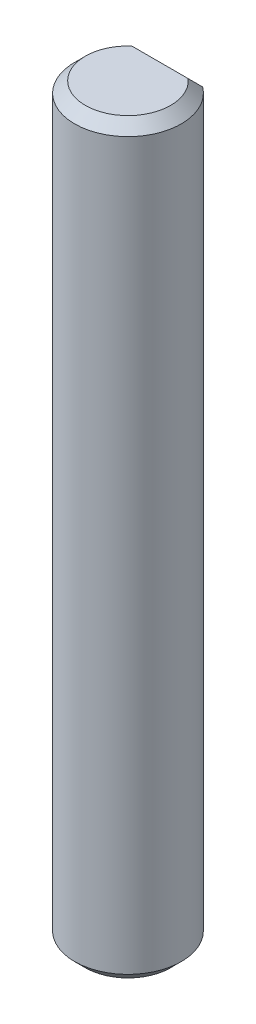
ISO-10303-21;
HEADER;
FILE_DESCRIPTION(('STEP AP214'),'2;1');
FILE_NAME('part.step','',(''),(''),'','','');
FILE_SCHEMA(('AUTOMOTIVE_DESIGN { 1 0 10303 214 1 1 1 1 }'));
ENDSEC;
DATA;
#1=APPLICATION_CONTEXT('core data for automotive mechanical design processes');
#2=APPLICATION_PROTOCOL_DEFINITION('international standard','automotive_design',2000,#1);
#3=PRODUCT_CONTEXT('',#1,'mechanical');
#4=PRODUCT('Part','Part','',(#3));
#5=PRODUCT_RELATED_PRODUCT_CATEGORY('part','',(#4));
#6=PRODUCT_DEFINITION_FORMATION('','',#4);
#7=PRODUCT_DEFINITION_CONTEXT('part definition',#1,'design');
#8=PRODUCT_DEFINITION('design','',#6,#7);
#9=PRODUCT_DEFINITION_SHAPE('','',#8);
#10=(LENGTH_UNIT() NAMED_UNIT(*) SI_UNIT(.MILLI.,.METRE.));
#11=(NAMED_UNIT(*) PLANE_ANGLE_UNIT() SI_UNIT($,.RADIAN.));
#12=(NAMED_UNIT(*) SI_UNIT($,.STERADIAN.) SOLID_ANGLE_UNIT());
#13=UNCERTAINTY_MEASURE_WITH_UNIT(LENGTH_MEASURE(1.E-05),#10,'distance_accuracy_value','');
#14=(GEOMETRIC_REPRESENTATION_CONTEXT(3) GLOBAL_UNCERTAINTY_ASSIGNED_CONTEXT((#13)) GLOBAL_UNIT_ASSIGNED_CONTEXT((#10,
#11,#12)) REPRESENTATION_CONTEXT('',''));
#15=CARTESIAN_POINT('',(0.,0.,0.));
#16=DIRECTION('',(0.,0.,1.));
#17=DIRECTION('',(1.,0.,0.));
#18=AXIS2_PLACEMENT_3D('',#15,#16,#17);
#19=CARTESIAN_POINT('',(0.,17.5,0.));
#20=DIRECTION('',(0.,-1.,0.));
#21=DIRECTION('',(0.,0.,-1.));
#22=AXIS2_PLACEMENT_3D('',#19,#20,#21);
#23=CYLINDRICAL_SURFACE('',#22,2.5);
#24=DIRECTION('',(0.,-1.,0.));
#25=VECTOR('',#24,1.);
#26=CARTESIAN_POINT('',(-1.5,17.5,-2.));
#27=LINE('',#26,#25);
#28=CARTESIAN_POINT('',(-1.5,-8.,-2.));
#29=VERTEX_POINT('',#28);
#30=CARTESIAN_POINT('',(-1.5,-17.,-2.));
#31=VERTEX_POINT('',#30);
#32=EDGE_CURVE('E111',#29,#31,#27,.T.);
#33=ORIENTED_EDGE('',*,*,#32,.T.);
#34=CARTESIAN_POINT('',(0.,-17.,0.));
#35=DIRECTION('',(0.,1.,0.));
#36=DIRECTION('',(0.,0.,1.));
#37=AXIS2_PLACEMENT_3D('',#34,#35,#36);
#38=CIRCLE('',#37,2.5);
#39=CARTESIAN_POINT('',(1.5,-17.,-2.));
#40=VERTEX_POINT('',#39);
#41=EDGE_CURVE('E108',#31,#40,#38,.T.);
#42=ORIENTED_EDGE('',*,*,#41,.T.);
#43=DIRECTION('',(0.,-1.,0.));
#44=VECTOR('',#43,1.);
#45=CARTESIAN_POINT('',(1.5,17.5,-2.));
#46=LINE('',#45,#44);
#47=CARTESIAN_POINT('',(1.5,-8.,-2.));
#48=VERTEX_POINT('',#47);
#49=EDGE_CURVE('E102',#40,#48,#46,.F.);
#50=ORIENTED_EDGE('',*,*,#49,.T.);
#51=CARTESIAN_POINT('',(0.,-8.,0.));
#52=DIRECTION('',(0.,1.,0.));
#53=DIRECTION('',(0.,0.,1.));
#54=AXIS2_PLACEMENT_3D('',#51,#52,#53);
#55=CIRCLE('',#54,2.5);
#56=EDGE_CURVE('E106',#48,#29,#55,.T.);
#57=ORIENTED_EDGE('',*,*,#56,.T.);
#58=EDGE_LOOP('',(#33,#42,#50,#57));
#59=FACE_BOUND('',#58,.T.);
#60=DIRECTION('',(0.,-1.,0.));
#61=VECTOR('',#60,1.);
#62=CARTESIAN_POINT('',(1.5,17.5,-2.));
#63=LINE('',#62,#61);
#64=CARTESIAN_POINT('',(1.5,17.,-2.));
#65=VERTEX_POINT('',#64);
#66=CARTESIAN_POINT('',(1.5,8.,-2.));
#67=VERTEX_POINT('',#66);
#68=EDGE_CURVE('E119',#65,#67,#63,.T.);
#69=ORIENTED_EDGE('',*,*,#68,.F.);
#70=CARTESIAN_POINT('',(0.,17.,0.));
#71=DIRECTION('',(0.,1.,0.));
#72=DIRECTION('',(0.,0.,1.));
#73=AXIS2_PLACEMENT_3D('',#70,#71,#72);
#74=CIRCLE('',#73,2.5);
#75=CARTESIAN_POINT('',(-1.5,17.,-2.));
#76=VERTEX_POINT('',#75);
#77=EDGE_CURVE('E145',#65,#76,#74,.F.);
#78=ORIENTED_EDGE('',*,*,#77,.T.);
#79=DIRECTION('',(0.,-1.,0.));
#80=VECTOR('',#79,1.);
#81=CARTESIAN_POINT('',(-1.5,17.5,-2.));
#82=LINE('',#81,#80);
#83=CARTESIAN_POINT('',(-1.5,8.,-2.));
#84=VERTEX_POINT('',#83);
#85=EDGE_CURVE('E130',#84,#76,#82,.F.);
#86=ORIENTED_EDGE('',*,*,#85,.F.);
#87=CARTESIAN_POINT('',(0.,8.,0.));
#88=DIRECTION('',(0.,-1.,0.));
#89=DIRECTION('',(0.,0.,-1.));
#90=AXIS2_PLACEMENT_3D('',#87,#88,#89);
#91=CIRCLE('',#90,2.5);
#92=EDGE_CURVE('E118',#84,#67,#91,.T.);
#93=ORIENTED_EDGE('',*,*,#92,.T.);
#94=EDGE_LOOP('',(#69,#78,#86,#93));
#95=FACE_BOUND('',#94,.T.);
#96=ADVANCED_FACE('F39',(#59,#95),#23,.T.);
#97=CARTESIAN_POINT('',(0.,17.5,0.));
#98=DIRECTION('',(0.,1.,0.));
#99=DIRECTION('',(0.,0.,1.));
#100=AXIS2_PLACEMENT_3D('',#97,#98,#99);
#101=PLANE('',#100);
#102=CARTESIAN_POINT('',(0.,17.5,0.));
#103=DIRECTION('',(0.,1.,0.));
#104=DIRECTION('',(0.,0.,1.));
#105=AXIS2_PLACEMENT_3D('',#102,#103,#104);
#106=CIRCLE('',#105,2.00000000000001);
#107=CARTESIAN_POINT('',(-1.3228756555323,17.5,-1.50000000000001));
#108=VERTEX_POINT('',#107);
#109=CARTESIAN_POINT('',(1.3228756555323,17.5,-1.50000000000001));
#110=VERTEX_POINT('',#109);
#111=EDGE_CURVE('E136',#108,#110,#106,.T.);
#112=ORIENTED_EDGE('',*,*,#111,.T.);
#113=DIRECTION('',(-1.,0.,0.));
#114=VECTOR('',#113,1.);
#115=CARTESIAN_POINT('',(0.,17.5,-1.50000000000001));
#116=LINE('',#115,#114);
#117=EDGE_CURVE('E138',#110,#108,#116,.T.);
#118=ORIENTED_EDGE('',*,*,#117,.T.);
#119=EDGE_LOOP('',(#112,#118));
#120=FACE_BOUND('',#119,.T.);
#121=ADVANCED_FACE('F185',(#120),#101,.T.);
#122=CARTESIAN_POINT('',(0.,-17.5,0.));
#123=DIRECTION('',(0.,1.,0.));
#124=DIRECTION('',(0.,0.,1.));
#125=AXIS2_PLACEMENT_3D('',#122,#123,#124);
#126=PLANE('',#125);
#127=CARTESIAN_POINT('',(0.,-17.5,0.));
#128=DIRECTION('',(0.,1.,0.));
#129=DIRECTION('',(0.,0.,1.));
#130=AXIS2_PLACEMENT_3D('',#127,#128,#129);
#131=CIRCLE('',#130,1.99999999999998);
#132=CARTESIAN_POINT('',(1.32287565553229,-17.5,-1.49999999999998));
#133=VERTEX_POINT('',#132);
#134=CARTESIAN_POINT('',(-1.32287565553229,-17.5,-1.49999999999998));
#135=VERTEX_POINT('',#134);
#136=EDGE_CURVE('E61',#133,#135,#131,.F.);
#137=ORIENTED_EDGE('',*,*,#136,.T.);
#138=DIRECTION('',(1.,0.,0.));
#139=VECTOR('',#138,1.);
#140=CARTESIAN_POINT('',(0.,-17.5,-1.49999999999998));
#141=LINE('',#140,#139);
#142=EDGE_CURVE('E54',#135,#133,#141,.T.);
#143=ORIENTED_EDGE('',*,*,#142,.T.);
#144=EDGE_LOOP('',(#137,#143));
#145=FACE_BOUND('',#144,.T.);
#146=ADVANCED_FACE('F183',(#145),#126,.F.);
#147=CARTESIAN_POINT('',(-2.89416499694655,-8.,-37.));
#148=DIRECTION('',(0.,1.,0.));
#149=DIRECTION('',(0.,0.,1.));
#150=AXIS2_PLACEMENT_3D('',#147,#148,#149);
#151=PLANE('',#150);
#152=DIRECTION('',(-1.,0.,0.));
#153=VECTOR('',#152,1.);
#154=CARTESIAN_POINT('',(-2.89416499694655,-8.,-2.));
#155=LINE('',#154,#153);
#156=EDGE_CURVE('E117',#48,#29,#155,.T.);
#157=ORIENTED_EDGE('',*,*,#156,.T.);
#158=ORIENTED_EDGE('',*,*,#56,.F.);
#159=EDGE_LOOP('',(#157,#158));
#160=FACE_BOUND('',#159,.T.);
#161=ADVANCED_FACE('F116',(#160),#151,.F.);
#162=CARTESIAN_POINT('',(0.,0.,-2.));
#163=DIRECTION('',(0.,0.,1.));
#164=DIRECTION('',(1.,0.,0.));
#165=AXIS2_PLACEMENT_3D('',#162,#163,#164);
#166=PLANE('',#165);
#167=ORIENTED_EDGE('',*,*,#49,.F.);
#168=DIRECTION('',(-1.,0.,0.));
#169=VECTOR('',#168,1.);
#170=CARTESIAN_POINT('',(0.,-17.,-2.));
#171=LINE('',#170,#169);
#172=EDGE_CURVE('E11',#40,#31,#171,.T.);
#173=ORIENTED_EDGE('',*,*,#172,.T.);
#174=ORIENTED_EDGE('',*,*,#32,.F.);
#175=ORIENTED_EDGE('',*,*,#156,.F.);
#176=EDGE_LOOP('',(#167,#173,#174,#175));
#177=FACE_BOUND('',#176,.T.);
#178=ADVANCED_FACE('F121',(#177),#166,.F.);
#179=CARTESIAN_POINT('',(-2.89416499694655,8.,-37.));
#180=DIRECTION('',(0.,-1.,0.));
#181=DIRECTION('',(0.,0.,-1.));
#182=AXIS2_PLACEMENT_3D('',#179,#180,#181);
#183=PLANE('',#182);
#184=DIRECTION('',(1.,0.,0.));
#185=VECTOR('',#184,1.);
#186=CARTESIAN_POINT('',(-2.89416499694655,8.,-2.));
#187=LINE('',#186,#185);
#188=EDGE_CURVE('E112',#84,#67,#187,.T.);
#189=ORIENTED_EDGE('',*,*,#188,.T.);
#190=ORIENTED_EDGE('',*,*,#92,.F.);
#191=EDGE_LOOP('',(#189,#190));
#192=FACE_BOUND('',#191,.T.);
#193=ADVANCED_FACE('F221',(#192),#183,.F.);
#194=CARTESIAN_POINT('',(0.,0.,-2.));
#195=DIRECTION('',(0.,0.,-1.));
#196=DIRECTION('',(-1.,0.,0.));
#197=AXIS2_PLACEMENT_3D('',#194,#195,#196);
#198=PLANE('',#197);
#199=ORIENTED_EDGE('',*,*,#85,.T.);
#200=DIRECTION('',(1.,0.,0.));
#201=VECTOR('',#200,1.);
#202=CARTESIAN_POINT('',(0.,17.,-2.));
#203=LINE('',#202,#201);
#204=EDGE_CURVE('E141',#76,#65,#203,.T.);
#205=ORIENTED_EDGE('',*,*,#204,.T.);
#206=ORIENTED_EDGE('',*,*,#68,.T.);
#207=ORIENTED_EDGE('',*,*,#188,.F.);
#208=EDGE_LOOP('',(#199,#205,#206,#207));
#209=FACE_BOUND('',#208,.T.);
#210=ADVANCED_FACE('F230',(#209),#198,.T.);
#211=CARTESIAN_POINT('',(0.,17.5,0.));
#212=DIRECTION('',(0.,-1.,0.));
#213=DIRECTION('',(0.,0.,-1.));
#214=AXIS2_PLACEMENT_3D('',#211,#212,#213);
#215=CONICAL_SURFACE('',#214,2.00000000000001,0.785398163397446);
#216=CARTESIAN_POINT('',(-1.3228756555323,17.5,-1.50000000000001));
#217=CARTESIAN_POINT('',(-1.33856024136969,17.4584991639331,-1.54150083606694));
#218=CARTESIAN_POINT('',(-1.35398671696421,17.4169498376851,-1.58305016231496));
#219=CARTESIAN_POINT('',(-1.38436438703584,17.3337667834554,-1.66623321654464));
#220=CARTESIAN_POINT('',(-1.39931560745199,17.2921330602124,-1.7078669397876));
#221=CARTESIAN_POINT('',(-1.42878519796258,17.2087898570011,-1.79121014299889));
#222=CARTESIAN_POINT('',(-1.44330357435469,17.1670803781444,-1.83291962185564));
#223=CARTESIAN_POINT('',(-1.47194219050032,17.0835906920568,-1.91640930794319));
#224=CARTESIAN_POINT('',(-1.48606240845706,17.0418104810861,-1.95818951891394));
#225=CARTESIAN_POINT('',(-1.5,17.,-2.));
#226=B_SPLINE_CURVE_WITH_KNOTS('',3,(#216,#217,#218,#219,#220,#221,#222,#223,#224,#225),
.UNSPECIFIED.,.F.,.F.,(4,2,2,2,4),(0.,0.182250890874288,0.364491817508485,0.546730091336216,
0.728978322325567),.UNSPECIFIED.);
#227=EDGE_CURVE('E126',#76,#108,#226,.F.);
#228=ORIENTED_EDGE('',*,*,#227,.F.);
#229=ORIENTED_EDGE('',*,*,#77,.F.);
#230=CARTESIAN_POINT('',(1.5,17.,-2.));
#231=CARTESIAN_POINT('',(1.48606240845706,17.0418104810861,-1.95818951891394));
#232=CARTESIAN_POINT('',(1.47194219050032,17.0835906920568,-1.91640930794319));
#233=CARTESIAN_POINT('',(1.44330357435469,17.1670803781444,-1.83291962185564));
#234=CARTESIAN_POINT('',(1.42878519796258,17.2087898570011,-1.79121014299889));
#235=CARTESIAN_POINT('',(1.39931560745199,17.2921330602124,-1.7078669397876));
#236=CARTESIAN_POINT('',(1.38436438703585,17.3337667834554,-1.66623321654464));
#237=CARTESIAN_POINT('',(1.35398671696421,17.4169498376851,-1.58305016231496));
#238=CARTESIAN_POINT('',(1.33856024136969,17.4584991639331,-1.54150083606694));
#239=CARTESIAN_POINT('',(1.3228756555323,17.5,-1.50000000000001));
#240=B_SPLINE_CURVE_WITH_KNOTS('',3,(#230,#231,#232,#233,#234,#235,#236,#237,#238,#239),
.UNSPECIFIED.,.F.,.F.,(4,2,2,2,4),(0.,0.182248230989351,0.364486504817082,0.546727431451279,
0.728978322325568),.UNSPECIFIED.);
#241=EDGE_CURVE('E122',#110,#65,#240,.F.);
#242=ORIENTED_EDGE('',*,*,#241,.F.);
#243=ORIENTED_EDGE('',*,*,#111,.F.);
#244=EDGE_LOOP('',(#228,#229,#242,#243));
#245=FACE_BOUND('',#244,.T.);
#246=ADVANCED_FACE('F160',(#245),#215,.T.);
#247=CARTESIAN_POINT('',(0.,17.5,-1.50000000000001));
#248=DIRECTION('',(0.,-0.707106781186546,0.707106781186549));
#249=DIRECTION('',(-1.,0.,0.));
#250=AXIS2_PLACEMENT_3D('',#247,#248,#249);
#251=PLANE('',#250);
#252=ORIENTED_EDGE('',*,*,#241,.T.);
#253=ORIENTED_EDGE('',*,*,#204,.F.);
#254=ORIENTED_EDGE('',*,*,#227,.T.);
#255=ORIENTED_EDGE('',*,*,#117,.F.);
#256=EDGE_LOOP('',(#252,#253,#254,#255));
#257=FACE_BOUND('',#256,.T.);
#258=ADVANCED_FACE('F164',(#257),#251,.F.);
#259=CARTESIAN_POINT('',(0.,-17.,0.));
#260=DIRECTION('',(0.,1.,0.));
#261=DIRECTION('',(0.,0.,1.));
#262=AXIS2_PLACEMENT_3D('',#259,#260,#261);
#263=CONICAL_SURFACE('',#262,2.5,0.78539816339745);
#264=CARTESIAN_POINT('',(1.32287565553229,-17.5,-1.49999999999998));
#265=CARTESIAN_POINT('',(1.33856024136969,-17.4584991639331,-1.54150083606692));
#266=CARTESIAN_POINT('',(1.35398671696421,-17.416949837685,-1.58305016231494));
#267=CARTESIAN_POINT('',(1.38436438703584,-17.3337667834554,-1.66623321654462));
#268=CARTESIAN_POINT('',(1.39931560745198,-17.2921330602124,-1.70786693978759));
#269=CARTESIAN_POINT('',(1.42878519796258,-17.2087898570011,-1.79121014299888));
#270=CARTESIAN_POINT('',(1.44330357435469,-17.1670803781444,-1.83291962185563));
#271=CARTESIAN_POINT('',(1.47194219050032,-17.0835906920568,-1.91640930794319));
#272=CARTESIAN_POINT('',(1.48606240845706,-17.041810481086,-1.95818951891394));
#273=CARTESIAN_POINT('',(1.5,-17.,-2.));
#274=B_SPLINE_CURVE_WITH_KNOTS('',3,(#264,#265,#266,#267,#268,#269,#270,#271,#272,#273),
.UNSPECIFIED.,.F.,.F.,(4,2,2,2,4),(0.,0.182250890874297,0.364491817508502,0.546730091336241,
0.7289783223256),.UNSPECIFIED.);
#275=EDGE_CURVE('E69',#40,#133,#274,.F.);
#276=ORIENTED_EDGE('',*,*,#275,.F.);
#277=ORIENTED_EDGE('',*,*,#41,.F.);
#278=CARTESIAN_POINT('',(-1.5,-17.,-2.));
#279=CARTESIAN_POINT('',(-1.48606240845706,-17.041810481086,-1.95818951891394));
#280=CARTESIAN_POINT('',(-1.47194219050032,-17.0835906920568,-1.91640930794319));
#281=CARTESIAN_POINT('',(-1.44330357435469,-17.1670803781444,-1.83291962185563));
#282=CARTESIAN_POINT('',(-1.42878519796258,-17.2087898570011,-1.79121014299888));
#283=CARTESIAN_POINT('',(-1.39931560745198,-17.2921330602124,-1.70786693978759));
#284=CARTESIAN_POINT('',(-1.38436438703584,-17.3337667834554,-1.66623321654462));
#285=CARTESIAN_POINT('',(-1.35398671696421,-17.416949837685,-1.58305016231494));
#286=CARTESIAN_POINT('',(-1.33856024136969,-17.4584991639331,-1.54150083606692));
#287=CARTESIAN_POINT('',(-1.32287565553229,-17.5,-1.49999999999998));
#288=B_SPLINE_CURVE_WITH_KNOTS('',3,(#278,#279,#280,#281,#282,#283,#284,#285,#286,#287),
.UNSPECIFIED.,.F.,.F.,(4,2,2,2,4),(0.,0.182248230989359,0.364486504817098,0.546727431451303,
0.728978322325601),.UNSPECIFIED.);
#289=EDGE_CURVE('E45',#135,#31,#288,.F.);
#290=ORIENTED_EDGE('',*,*,#289,.F.);
#291=ORIENTED_EDGE('',*,*,#136,.F.);
#292=EDGE_LOOP('',(#276,#277,#290,#291));
#293=FACE_BOUND('',#292,.T.);
#294=ADVANCED_FACE('F169',(#293),#263,.T.);
#295=CARTESIAN_POINT('',(0.,-17.5,-1.49999999999998));
#296=DIRECTION('',(0.,0.707106781186548,0.707106781186547));
#297=DIRECTION('',(1.,0.,0.));
#298=AXIS2_PLACEMENT_3D('',#295,#296,#297);
#299=PLANE('',#298);
#300=ORIENTED_EDGE('',*,*,#289,.T.);
#301=ORIENTED_EDGE('',*,*,#172,.F.);
#302=ORIENTED_EDGE('',*,*,#275,.T.);
#303=ORIENTED_EDGE('',*,*,#142,.F.);
#304=EDGE_LOOP('',(#300,#301,#302,#303));
#305=FACE_BOUND('',#304,.T.);
#306=ADVANCED_FACE('F42',(#305),#299,.F.);
#307=CLOSED_SHELL('',(#96,#121,#146,#161,#178,#193,#210,#246,#258,#294,#306));
#308=MANIFOLD_SOLID_BREP('B2',#307);
#309=ADVANCED_BREP_SHAPE_REPRESENTATION('',(#18,#308),#14);
#310=SHAPE_DEFINITION_REPRESENTATION(#9,#309);
ENDSEC;
END-ISO-10303-21;
